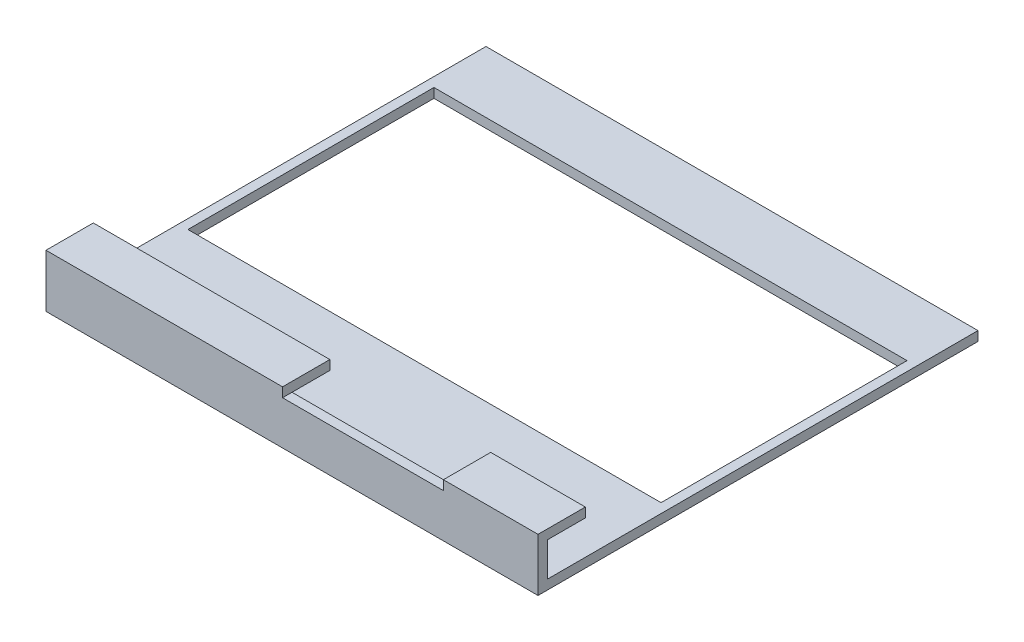
ISO-10303-21;
HEADER;
FILE_DESCRIPTION(('STEP AP214'),'2;1');
FILE_NAME('part.step','',(''),(''),'','','');
FILE_SCHEMA(('AUTOMOTIVE_DESIGN { 1 0 10303 214 1 1 1 1 }'));
ENDSEC;
DATA;
#1=APPLICATION_CONTEXT('core data for automotive mechanical design processes');
#2=APPLICATION_PROTOCOL_DEFINITION('international standard','automotive_design',2000,#1);
#3=PRODUCT_CONTEXT('',#1,'mechanical');
#4=PRODUCT('Part','Part','',(#3));
#5=PRODUCT_RELATED_PRODUCT_CATEGORY('part','',(#4));
#6=PRODUCT_DEFINITION_FORMATION('','',#4);
#7=PRODUCT_DEFINITION_CONTEXT('part definition',#1,'design');
#8=PRODUCT_DEFINITION('design','',#6,#7);
#9=PRODUCT_DEFINITION_SHAPE('','',#8);
#10=(LENGTH_UNIT() NAMED_UNIT(*) SI_UNIT(.MILLI.,.METRE.));
#11=(NAMED_UNIT(*) PLANE_ANGLE_UNIT() SI_UNIT($,.RADIAN.));
#12=(NAMED_UNIT(*) SI_UNIT($,.STERADIAN.) SOLID_ANGLE_UNIT());
#13=UNCERTAINTY_MEASURE_WITH_UNIT(LENGTH_MEASURE(1.E-05),#10,'distance_accuracy_value','');
#14=(GEOMETRIC_REPRESENTATION_CONTEXT(3) GLOBAL_UNCERTAINTY_ASSIGNED_CONTEXT((#13)) GLOBAL_UNIT_ASSIGNED_CONTEXT((#10,
#11,#12)) REPRESENTATION_CONTEXT('',''));
#15=CARTESIAN_POINT('',(0.,0.,0.));
#16=DIRECTION('',(0.,0.,1.));
#17=DIRECTION('',(1.,0.,0.));
#18=AXIS2_PLACEMENT_3D('',#15,#16,#17);
#19=CARTESIAN_POINT('',(104.,9.20000000000001,-10.));
#20=DIRECTION('',(0.,1.,0.));
#21=DIRECTION('',(0.,0.,1.));
#22=AXIS2_PLACEMENT_3D('',#19,#20,#21);
#23=PLANE('',#22);
#24=DIRECTION('',(-1.,0.,0.));
#25=VECTOR('',#24,1.);
#26=CARTESIAN_POINT('',(104.,9.20000000000001,-10.));
#27=LINE('',#26,#25);
#28=CARTESIAN_POINT('',(50.,9.20000000000001,-10.));
#29=VERTEX_POINT('',#28);
#30=CARTESIAN_POINT('',(0.,9.20000000000001,-10.));
#31=VERTEX_POINT('',#30);
#32=EDGE_CURVE('E267',#29,#31,#27,.T.);
#33=ORIENTED_EDGE('',*,*,#32,.F.);
#34=DIRECTION('',(0.,0.,-1.));
#35=VECTOR('',#34,1.);
#36=CARTESIAN_POINT('',(50.,9.20000000000001,-9.99999999999998));
#37=LINE('',#36,#35);
#38=CARTESIAN_POINT('',(50.,9.20000000000001,-2.));
#39=VERTEX_POINT('',#38);
#40=EDGE_CURVE('E198',#39,#29,#37,.T.);
#41=ORIENTED_EDGE('',*,*,#40,.F.);
#42=DIRECTION('',(-1.,0.,0.));
#43=VECTOR('',#42,1.);
#44=CARTESIAN_POINT('',(104.,9.20000000000001,-2.));
#45=LINE('',#44,#43);
#46=CARTESIAN_POINT('',(0.,9.20000000000001,-2.));
#47=VERTEX_POINT('',#46);
#48=EDGE_CURVE('E271',#39,#47,#45,.T.);
#49=ORIENTED_EDGE('',*,*,#48,.T.);
#50=DIRECTION('',(0.,0.,-1.));
#51=VECTOR('',#50,1.);
#52=CARTESIAN_POINT('',(0.,9.20000000000001,-10.));
#53=LINE('',#52,#51);
#54=EDGE_CURVE('E252',#47,#31,#53,.T.);
#55=ORIENTED_EDGE('',*,*,#54,.T.);
#56=EDGE_LOOP('',(#33,#41,#49,#55));
#57=FACE_BOUND('',#56,.T.);
#58=ADVANCED_FACE('F39',(#57),#23,.F.);
#59=CARTESIAN_POINT('',(104.,11.2,-10.));
#60=DIRECTION('',(0.,0.,1.));
#61=DIRECTION('',(1.,0.,0.));
#62=AXIS2_PLACEMENT_3D('',#59,#60,#61);
#63=PLANE('',#62);
#64=DIRECTION('',(-1.,0.,0.));
#65=VECTOR('',#64,1.);
#66=CARTESIAN_POINT('',(104.,11.2,-10.));
#67=LINE('',#66,#65);
#68=CARTESIAN_POINT('',(50.,11.2,-10.));
#69=VERTEX_POINT('',#68);
#70=CARTESIAN_POINT('',(0.,11.2,-10.));
#71=VERTEX_POINT('',#70);
#72=EDGE_CURVE('E263',#69,#71,#67,.T.);
#73=ORIENTED_EDGE('',*,*,#72,.F.);
#74=DIRECTION('',(0.,1.,0.));
#75=VECTOR('',#74,1.);
#76=CARTESIAN_POINT('',(50.,-26.2400902933387,-10.));
#77=LINE('',#76,#75);
#78=EDGE_CURVE('E208',#29,#69,#77,.T.);
#79=ORIENTED_EDGE('',*,*,#78,.F.);
#80=ORIENTED_EDGE('',*,*,#32,.T.);
#81=DIRECTION('',(0.,1.,0.));
#82=VECTOR('',#81,1.);
#83=CARTESIAN_POINT('',(0.,11.2,-10.));
#84=LINE('',#83,#82);
#85=EDGE_CURVE('E255',#31,#71,#84,.T.);
#86=ORIENTED_EDGE('',*,*,#85,.T.);
#87=EDGE_LOOP('',(#73,#79,#80,#86));
#88=FACE_BOUND('',#87,.T.);
#89=ADVANCED_FACE('F319',(#88),#63,.F.);
#90=CARTESIAN_POINT('',(104.,11.2,0.));
#91=DIRECTION('',(0.,-1.,0.));
#92=DIRECTION('',(0.,0.,-1.));
#93=AXIS2_PLACEMENT_3D('',#90,#91,#92);
#94=PLANE('',#93);
#95=DIRECTION('',(-1.,0.,0.));
#96=VECTOR('',#95,1.);
#97=CARTESIAN_POINT('',(104.,11.2,0.));
#98=LINE('',#97,#96);
#99=CARTESIAN_POINT('',(50.,11.2,0.));
#100=VERTEX_POINT('',#99);
#101=CARTESIAN_POINT('',(0.,11.2,0.));
#102=VERTEX_POINT('',#101);
#103=EDGE_CURVE('E240',#100,#102,#98,.T.);
#104=ORIENTED_EDGE('',*,*,#103,.F.);
#105=DIRECTION('',(0.,0.,1.));
#106=VECTOR('',#105,1.);
#107=CARTESIAN_POINT('',(50.,11.2,-10.));
#108=LINE('',#107,#106);
#109=EDGE_CURVE('E172',#69,#100,#108,.T.);
#110=ORIENTED_EDGE('',*,*,#109,.F.);
#111=ORIENTED_EDGE('',*,*,#72,.T.);
#112=DIRECTION('',(0.,0.,1.));
#113=VECTOR('',#112,1.);
#114=CARTESIAN_POINT('',(0.,11.2,0.));
#115=LINE('',#114,#113);
#116=EDGE_CURVE('E226',#71,#102,#115,.T.);
#117=ORIENTED_EDGE('',*,*,#116,.T.);
#118=EDGE_LOOP('',(#104,#110,#111,#117));
#119=FACE_BOUND('',#118,.T.);
#120=ADVANCED_FACE('F314',(#119),#94,.F.);
#121=CARTESIAN_POINT('',(104.,0.,0.));
#122=DIRECTION('',(0.,0.,-1.));
#123=DIRECTION('',(-1.,0.,0.));
#124=AXIS2_PLACEMENT_3D('',#121,#122,#123);
#125=PLANE('',#124);
#126=DIRECTION('',(-1.,0.,0.));
#127=VECTOR('',#126,1.);
#128=CARTESIAN_POINT('',(50.,9.20000000000001,0.));
#129=LINE('',#128,#127);
#130=CARTESIAN_POINT('',(84.,9.20000000000001,0.));
#131=VERTEX_POINT('',#130);
#132=CARTESIAN_POINT('',(50.,9.20000000000001,0.));
#133=VERTEX_POINT('',#132);
#134=EDGE_CURVE('E203',#131,#133,#129,.T.);
#135=ORIENTED_EDGE('',*,*,#134,.T.);
#136=DIRECTION('',(0.,1.,0.));
#137=VECTOR('',#136,1.);
#138=CARTESIAN_POINT('',(50.,-26.2400902933387,0.));
#139=LINE('',#138,#137);
#140=EDGE_CURVE('E207',#133,#100,#139,.T.);
#141=ORIENTED_EDGE('',*,*,#140,.T.);
#142=ORIENTED_EDGE('',*,*,#103,.T.);
#143=DIRECTION('',(0.,-1.,0.));
#144=VECTOR('',#143,1.);
#145=CARTESIAN_POINT('',(0.,0.,0.));
#146=LINE('',#145,#144);
#147=CARTESIAN_POINT('',(0.,0.,0.));
#148=VERTEX_POINT('',#147);
#149=EDGE_CURVE('E221',#102,#148,#146,.T.);
#150=ORIENTED_EDGE('',*,*,#149,.T.);
#151=DIRECTION('',(-1.,0.,0.));
#152=VECTOR('',#151,1.);
#153=CARTESIAN_POINT('',(104.,0.,0.));
#154=LINE('',#153,#152);
#155=CARTESIAN_POINT('',(104.,0.,0.));
#156=VERTEX_POINT('',#155);
#157=EDGE_CURVE('E11',#156,#148,#154,.T.);
#158=ORIENTED_EDGE('',*,*,#157,.F.);
#159=DIRECTION('',(0.,-1.,0.));
#160=VECTOR('',#159,1.);
#161=CARTESIAN_POINT('',(104.,0.,0.));
#162=LINE('',#161,#160);
#163=CARTESIAN_POINT('',(104.,11.2,0.));
#164=VERTEX_POINT('',#163);
#165=EDGE_CURVE('E222',#164,#156,#162,.T.);
#166=ORIENTED_EDGE('',*,*,#165,.F.);
#167=CARTESIAN_POINT('',(84.,11.2,0.));
#168=VERTEX_POINT('',#167);
#169=EDGE_CURVE('E260',#164,#168,#98,.T.);
#170=ORIENTED_EDGE('',*,*,#169,.T.);
#171=DIRECTION('',(0.,1.,0.));
#172=VECTOR('',#171,1.);
#173=CARTESIAN_POINT('',(84.,-26.2400902933387,0.));
#174=LINE('',#173,#172);
#175=EDGE_CURVE('E213',#131,#168,#174,.T.);
#176=ORIENTED_EDGE('',*,*,#175,.F.);
#177=EDGE_LOOP('',(#135,#141,#142,#150,#158,#166,#170,#176));
#178=FACE_BOUND('',#177,.T.);
#179=ADVANCED_FACE('F41',(#178),#125,.F.);
#180=CARTESIAN_POINT('',(104.,0.,0.));
#181=DIRECTION('',(0.,1.,0.));
#182=DIRECTION('',(0.,0.,1.));
#183=AXIS2_PLACEMENT_3D('',#180,#181,#182);
#184=PLANE('',#183);
#185=DIRECTION('',(1.,0.,0.));
#186=VECTOR('',#185,1.);
#187=CARTESIAN_POINT('',(2.,0.,-80.));
#188=LINE('',#187,#186);
#189=CARTESIAN_POINT('',(2.,0.,-80.));
#190=VERTEX_POINT('',#189);
#191=CARTESIAN_POINT('',(102.,0.,-80.));
#192=VERTEX_POINT('',#191);
#193=EDGE_CURVE('E178',#190,#192,#188,.T.);
#194=ORIENTED_EDGE('',*,*,#193,.F.);
#195=DIRECTION('',(0.,0.,-1.));
#196=VECTOR('',#195,1.);
#197=CARTESIAN_POINT('',(2.,0.,-80.));
#198=LINE('',#197,#196);
#199=CARTESIAN_POINT('',(2.00000000000001,0.,-28.));
#200=VERTEX_POINT('',#199);
#201=EDGE_CURVE('E160',#200,#190,#198,.T.);
#202=ORIENTED_EDGE('',*,*,#201,.F.);
#203=DIRECTION('',(-1.,0.,0.));
#204=VECTOR('',#203,1.);
#205=CARTESIAN_POINT('',(2.00000000000001,0.,-28.));
#206=LINE('',#205,#204);
#207=CARTESIAN_POINT('',(102.,0.,-28.));
#208=VERTEX_POINT('',#207);
#209=EDGE_CURVE('E169',#208,#200,#206,.T.);
#210=ORIENTED_EDGE('',*,*,#209,.F.);
#211=DIRECTION('',(0.,0.,1.));
#212=VECTOR('',#211,1.);
#213=CARTESIAN_POINT('',(102.,0.,-80.));
#214=LINE('',#213,#212);
#215=EDGE_CURVE('E54',#192,#208,#214,.T.);
#216=ORIENTED_EDGE('',*,*,#215,.F.);
#217=EDGE_LOOP('',(#194,#202,#210,#216));
#218=FACE_BOUND('',#217,.T.);
#219=DIRECTION('',(0.,0.,-1.));
#220=VECTOR('',#219,1.);
#221=CARTESIAN_POINT('',(0.,0.,0.));
#222=LINE('',#221,#220);
#223=CARTESIAN_POINT('',(0.,0.,-93.));
#224=VERTEX_POINT('',#223);
#225=EDGE_CURVE('E243',#148,#224,#222,.T.);
#226=ORIENTED_EDGE('',*,*,#225,.T.);
#227=DIRECTION('',(-1.,0.,0.));
#228=VECTOR('',#227,1.);
#229=CARTESIAN_POINT('',(104.,0.,-93.));
#230=LINE('',#229,#228);
#231=CARTESIAN_POINT('',(104.,0.,-93.));
#232=VERTEX_POINT('',#231);
#233=EDGE_CURVE('E47',#232,#224,#230,.T.);
#234=ORIENTED_EDGE('',*,*,#233,.F.);
#235=DIRECTION('',(0.,0.,-1.));
#236=VECTOR('',#235,1.);
#237=CARTESIAN_POINT('',(104.,0.,0.));
#238=LINE('',#237,#236);
#239=EDGE_CURVE('E225',#156,#232,#238,.T.);
#240=ORIENTED_EDGE('',*,*,#239,.F.);
#241=ORIENTED_EDGE('',*,*,#157,.T.);
#242=EDGE_LOOP('',(#226,#234,#240,#241));
#243=FACE_BOUND('',#242,.T.);
#244=ADVANCED_FACE('F175',(#218,#243),#184,.F.);
#245=CARTESIAN_POINT('',(104.,0.,-93.));
#246=DIRECTION('',(0.,0.,1.));
#247=DIRECTION('',(1.,0.,0.));
#248=AXIS2_PLACEMENT_3D('',#245,#246,#247);
#249=PLANE('',#248);
#250=DIRECTION('',(0.,1.,0.));
#251=VECTOR('',#250,1.);
#252=CARTESIAN_POINT('',(0.,0.,-93.));
#253=LINE('',#252,#251);
#254=CARTESIAN_POINT('',(0.,2.00000000000001,-93.));
#255=VERTEX_POINT('',#254);
#256=EDGE_CURVE('E245',#224,#255,#253,.T.);
#257=ORIENTED_EDGE('',*,*,#256,.T.);
#258=DIRECTION('',(-1.,0.,0.));
#259=VECTOR('',#258,1.);
#260=CARTESIAN_POINT('',(104.,2.00000000000001,-93.));
#261=LINE('',#260,#259);
#262=CARTESIAN_POINT('',(104.,2.00000000000001,-93.));
#263=VERTEX_POINT('',#262);
#264=EDGE_CURVE('E278',#263,#255,#261,.T.);
#265=ORIENTED_EDGE('',*,*,#264,.F.);
#266=DIRECTION('',(0.,1.,0.));
#267=VECTOR('',#266,1.);
#268=CARTESIAN_POINT('',(104.,0.,-93.));
#269=LINE('',#268,#267);
#270=EDGE_CURVE('E228',#232,#263,#269,.T.);
#271=ORIENTED_EDGE('',*,*,#270,.F.);
#272=ORIENTED_EDGE('',*,*,#233,.T.);
#273=EDGE_LOOP('',(#257,#265,#271,#272));
#274=FACE_BOUND('',#273,.T.);
#275=ADVANCED_FACE('F285',(#274),#249,.F.);
#276=CARTESIAN_POINT('',(104.,2.00000000000001,-93.));
#277=DIRECTION('',(0.,-1.,0.));
#278=DIRECTION('',(0.,0.,-1.));
#279=AXIS2_PLACEMENT_3D('',#276,#277,#278);
#280=PLANE('',#279);
#281=DIRECTION('',(1.,0.,0.));
#282=VECTOR('',#281,1.);
#283=CARTESIAN_POINT('',(2.00000000000001,2.00000000000001,-28.));
#284=LINE('',#283,#282);
#285=CARTESIAN_POINT('',(2.,2.00000000000001,-28.));
#286=VERTEX_POINT('',#285);
#287=CARTESIAN_POINT('',(102.,2.00000000000001,-28.));
#288=VERTEX_POINT('',#287);
#289=EDGE_CURVE('E180',#286,#288,#284,.T.);
#290=ORIENTED_EDGE('',*,*,#289,.F.);
#291=DIRECTION('',(0.,0.,1.));
#292=VECTOR('',#291,1.);
#293=CARTESIAN_POINT('',(2.,2.00000000000001,-80.));
#294=LINE('',#293,#292);
#295=CARTESIAN_POINT('',(2.,2.00000000000001,-80.));
#296=VERTEX_POINT('',#295);
#297=EDGE_CURVE('E62',#296,#286,#294,.T.);
#298=ORIENTED_EDGE('',*,*,#297,.F.);
#299=DIRECTION('',(-1.,0.,0.));
#300=VECTOR('',#299,1.);
#301=CARTESIAN_POINT('',(2.,2.00000000000001,-80.));
#302=LINE('',#301,#300);
#303=CARTESIAN_POINT('',(102.,2.00000000000001,-80.));
#304=VERTEX_POINT('',#303);
#305=EDGE_CURVE('E166',#304,#296,#302,.T.);
#306=ORIENTED_EDGE('',*,*,#305,.F.);
#307=DIRECTION('',(0.,0.,-1.));
#308=VECTOR('',#307,1.);
#309=CARTESIAN_POINT('',(102.,2.00000000000001,-80.));
#310=LINE('',#309,#308);
#311=EDGE_CURVE('E186',#288,#304,#310,.T.);
#312=ORIENTED_EDGE('',*,*,#311,.F.);
#313=EDGE_LOOP('',(#290,#298,#306,#312));
#314=FACE_BOUND('',#313,.T.);
#315=DIRECTION('',(0.,0.,1.));
#316=VECTOR('',#315,1.);
#317=CARTESIAN_POINT('',(0.,2.00000000000001,-93.));
#318=LINE('',#317,#316);
#319=CARTESIAN_POINT('',(0.,2.00000000000001,-2.));
#320=VERTEX_POINT('',#319);
#321=EDGE_CURVE('E247',#255,#320,#318,.T.);
#322=ORIENTED_EDGE('',*,*,#321,.T.);
#323=DIRECTION('',(-1.,0.,0.));
#324=VECTOR('',#323,1.);
#325=CARTESIAN_POINT('',(104.,2.00000000000001,-2.));
#326=LINE('',#325,#324);
#327=CARTESIAN_POINT('',(104.,2.00000000000001,-2.));
#328=VERTEX_POINT('',#327);
#329=EDGE_CURVE('E275',#328,#320,#326,.T.);
#330=ORIENTED_EDGE('',*,*,#329,.F.);
#331=DIRECTION('',(0.,0.,1.));
#332=VECTOR('',#331,1.);
#333=CARTESIAN_POINT('',(104.,2.00000000000001,-93.));
#334=LINE('',#333,#332);
#335=EDGE_CURVE('E230',#263,#328,#334,.T.);
#336=ORIENTED_EDGE('',*,*,#335,.F.);
#337=ORIENTED_EDGE('',*,*,#264,.T.);
#338=EDGE_LOOP('',(#322,#330,#336,#337));
#339=FACE_BOUND('',#338,.T.);
#340=ADVANCED_FACE('F295',(#314,#339),#280,.F.);
#341=CARTESIAN_POINT('',(104.,2.00000000000001,-2.));
#342=DIRECTION('',(0.,0.,1.));
#343=DIRECTION('',(1.,0.,0.));
#344=AXIS2_PLACEMENT_3D('',#341,#342,#343);
#345=PLANE('',#344);
#346=DIRECTION('',(0.,1.,0.));
#347=VECTOR('',#346,1.);
#348=CARTESIAN_POINT('',(0.,2.00000000000001,-2.));
#349=LINE('',#348,#347);
#350=EDGE_CURVE('E249',#320,#47,#349,.T.);
#351=ORIENTED_EDGE('',*,*,#350,.T.);
#352=ORIENTED_EDGE('',*,*,#48,.F.);
#353=DIRECTION('',(-1.,0.,0.));
#354=VECTOR('',#353,1.);
#355=CARTESIAN_POINT('',(104.,9.20000000000001,-2.));
#356=LINE('',#355,#354);
#357=CARTESIAN_POINT('',(84.,9.20000000000001,-2.));
#358=VERTEX_POINT('',#357);
#359=EDGE_CURVE('E219',#358,#39,#356,.T.);
#360=ORIENTED_EDGE('',*,*,#359,.F.);
#361=CARTESIAN_POINT('',(104.,9.20000000000001,-2.));
#362=VERTEX_POINT('',#361);
#363=EDGE_CURVE('E272',#362,#358,#45,.T.);
#364=ORIENTED_EDGE('',*,*,#363,.F.);
#365=DIRECTION('',(0.,1.,0.));
#366=VECTOR('',#365,1.);
#367=CARTESIAN_POINT('',(104.,2.00000000000001,-2.));
#368=LINE('',#367,#366);
#369=EDGE_CURVE('E232',#328,#362,#368,.T.);
#370=ORIENTED_EDGE('',*,*,#369,.F.);
#371=ORIENTED_EDGE('',*,*,#329,.T.);
#372=EDGE_LOOP('',(#351,#352,#360,#364,#370,#371));
#373=FACE_BOUND('',#372,.T.);
#374=ADVANCED_FACE('F299',(#373),#345,.F.);
#375=ORIENTED_EDGE('',*,*,#363,.T.);
#376=DIRECTION('',(0.,0.,1.));
#377=VECTOR('',#376,1.);
#378=CARTESIAN_POINT('',(84.,9.20000000000001,-9.99999999999998));
#379=LINE('',#378,#377);
#380=CARTESIAN_POINT('',(84.,9.20000000000001,-10.));
#381=VERTEX_POINT('',#380);
#382=EDGE_CURVE('E195',#381,#358,#379,.T.);
#383=ORIENTED_EDGE('',*,*,#382,.F.);
#384=CARTESIAN_POINT('',(104.,9.20000000000001,-10.));
#385=VERTEX_POINT('',#384);
#386=EDGE_CURVE('E268',#385,#381,#27,.T.);
#387=ORIENTED_EDGE('',*,*,#386,.F.);
#388=DIRECTION('',(0.,0.,-1.));
#389=VECTOR('',#388,1.);
#390=CARTESIAN_POINT('',(104.,9.20000000000001,-10.));
#391=LINE('',#390,#389);
#392=EDGE_CURVE('E234',#362,#385,#391,.T.);
#393=ORIENTED_EDGE('',*,*,#392,.F.);
#394=EDGE_LOOP('',(#375,#383,#387,#393));
#395=FACE_BOUND('',#394,.T.);
#396=ADVANCED_FACE('F326',(#395),#23,.F.);
#397=ORIENTED_EDGE('',*,*,#386,.T.);
#398=DIRECTION('',(0.,1.,0.));
#399=VECTOR('',#398,1.);
#400=CARTESIAN_POINT('',(84.,-26.2400902933387,-10.));
#401=LINE('',#400,#399);
#402=CARTESIAN_POINT('',(84.,11.2,-10.));
#403=VERTEX_POINT('',#402);
#404=EDGE_CURVE('E210',#381,#403,#401,.T.);
#405=ORIENTED_EDGE('',*,*,#404,.T.);
#406=CARTESIAN_POINT('',(104.,11.2,-10.));
#407=VERTEX_POINT('',#406);
#408=EDGE_CURVE('E264',#407,#403,#67,.T.);
#409=ORIENTED_EDGE('',*,*,#408,.F.);
#410=DIRECTION('',(0.,1.,0.));
#411=VECTOR('',#410,1.);
#412=CARTESIAN_POINT('',(104.,11.2,-10.));
#413=LINE('',#412,#411);
#414=EDGE_CURVE('E236',#385,#407,#413,.T.);
#415=ORIENTED_EDGE('',*,*,#414,.F.);
#416=EDGE_LOOP('',(#397,#405,#409,#415));
#417=FACE_BOUND('',#416,.T.);
#418=ADVANCED_FACE('F330',(#417),#63,.F.);
#419=ORIENTED_EDGE('',*,*,#408,.T.);
#420=DIRECTION('',(0.,0.,-1.));
#421=VECTOR('',#420,1.);
#422=CARTESIAN_POINT('',(84.,11.2,-10.));
#423=LINE('',#422,#421);
#424=EDGE_CURVE('E205',#168,#403,#423,.T.);
#425=ORIENTED_EDGE('',*,*,#424,.F.);
#426=ORIENTED_EDGE('',*,*,#169,.F.);
#427=DIRECTION('',(0.,0.,1.));
#428=VECTOR('',#427,1.);
#429=CARTESIAN_POINT('',(104.,11.2,0.));
#430=LINE('',#429,#428);
#431=EDGE_CURVE('E238',#407,#164,#430,.T.);
#432=ORIENTED_EDGE('',*,*,#431,.F.);
#433=EDGE_LOOP('',(#419,#425,#426,#432));
#434=FACE_BOUND('',#433,.T.);
#435=ADVANCED_FACE('F335',(#434),#94,.F.);
#436=CARTESIAN_POINT('',(104.,0.,0.));
#437=DIRECTION('',(-1.,0.,0.));
#438=DIRECTION('',(0.,0.,1.));
#439=AXIS2_PLACEMENT_3D('',#436,#437,#438);
#440=PLANE('',#439);
#441=ORIENTED_EDGE('',*,*,#165,.T.);
#442=ORIENTED_EDGE('',*,*,#239,.T.);
#443=ORIENTED_EDGE('',*,*,#270,.T.);
#444=ORIENTED_EDGE('',*,*,#335,.T.);
#445=ORIENTED_EDGE('',*,*,#369,.T.);
#446=ORIENTED_EDGE('',*,*,#392,.T.);
#447=ORIENTED_EDGE('',*,*,#414,.T.);
#448=ORIENTED_EDGE('',*,*,#431,.T.);
#449=EDGE_LOOP('',(#441,#442,#443,#444,#445,#446,#447,#448));
#450=FACE_BOUND('',#449,.T.);
#451=ADVANCED_FACE('F305',(#450),#440,.F.);
#452=CARTESIAN_POINT('',(0.,0.,0.));
#453=DIRECTION('',(-1.,0.,0.));
#454=DIRECTION('',(0.,0.,1.));
#455=AXIS2_PLACEMENT_3D('',#452,#453,#454);
#456=PLANE('',#455);
#457=ORIENTED_EDGE('',*,*,#149,.F.);
#458=ORIENTED_EDGE('',*,*,#116,.F.);
#459=ORIENTED_EDGE('',*,*,#85,.F.);
#460=ORIENTED_EDGE('',*,*,#54,.F.);
#461=ORIENTED_EDGE('',*,*,#350,.F.);
#462=ORIENTED_EDGE('',*,*,#321,.F.);
#463=ORIENTED_EDGE('',*,*,#256,.F.);
#464=ORIENTED_EDGE('',*,*,#225,.F.);
#465=EDGE_LOOP('',(#457,#458,#459,#460,#461,#462,#463,#464));
#466=FACE_BOUND('',#465,.T.);
#467=ADVANCED_FACE('F290',(#466),#456,.T.);
#468=CARTESIAN_POINT('',(104.,9.20000000000001,-10.));
#469=DIRECTION('',(0.,1.,0.));
#470=DIRECTION('',(0.,0.,1.));
#471=AXIS2_PLACEMENT_3D('',#468,#469,#470);
#472=PLANE('',#471);
#473=ORIENTED_EDGE('',*,*,#359,.T.);
#474=EDGE_CURVE('E200',#133,#39,#37,.T.);
#475=ORIENTED_EDGE('',*,*,#474,.F.);
#476=ORIENTED_EDGE('',*,*,#134,.F.);
#477=EDGE_CURVE('E199',#358,#131,#379,.T.);
#478=ORIENTED_EDGE('',*,*,#477,.F.);
#479=EDGE_LOOP('',(#473,#475,#476,#478));
#480=FACE_BOUND('',#479,.T.);
#481=ADVANCED_FACE('F340',(#480),#472,.T.);
#482=CARTESIAN_POINT('',(50.,-26.2400902933387,-10.));
#483=DIRECTION('',(-1.,0.,0.));
#484=DIRECTION('',(0.,0.,1.));
#485=AXIS2_PLACEMENT_3D('',#482,#483,#484);
#486=PLANE('',#485);
#487=ORIENTED_EDGE('',*,*,#474,.T.);
#488=ORIENTED_EDGE('',*,*,#40,.T.);
#489=ORIENTED_EDGE('',*,*,#78,.T.);
#490=ORIENTED_EDGE('',*,*,#109,.T.);
#491=ORIENTED_EDGE('',*,*,#140,.F.);
#492=EDGE_LOOP('',(#487,#488,#489,#490,#491));
#493=FACE_BOUND('',#492,.T.);
#494=ADVANCED_FACE('F343',(#493),#486,.F.);
#495=CARTESIAN_POINT('',(84.,-26.2400902933387,-10.));
#496=DIRECTION('',(1.,0.,0.));
#497=DIRECTION('',(0.,0.,-1.));
#498=AXIS2_PLACEMENT_3D('',#495,#496,#497);
#499=PLANE('',#498);
#500=ORIENTED_EDGE('',*,*,#382,.T.);
#501=ORIENTED_EDGE('',*,*,#477,.T.);
#502=ORIENTED_EDGE('',*,*,#175,.T.);
#503=ORIENTED_EDGE('',*,*,#424,.T.);
#504=ORIENTED_EDGE('',*,*,#404,.F.);
#505=EDGE_LOOP('',(#500,#501,#502,#503,#504));
#506=FACE_BOUND('',#505,.T.);
#507=ADVANCED_FACE('F339',(#506),#499,.F.);
#508=CARTESIAN_POINT('',(2.,-0.00100000000000013,-80.));
#509=DIRECTION('',(-1.,0.,0.));
#510=DIRECTION('',(0.,0.,1.));
#511=AXIS2_PLACEMENT_3D('',#508,#509,#510);
#512=PLANE('',#511);
#513=ORIENTED_EDGE('',*,*,#201,.T.);
#514=DIRECTION('',(0.,1.,0.));
#515=VECTOR('',#514,1.);
#516=CARTESIAN_POINT('',(2.,-0.00100000000000013,-80.));
#517=LINE('',#516,#515);
#518=EDGE_CURVE('E173',#190,#296,#517,.T.);
#519=ORIENTED_EDGE('',*,*,#518,.T.);
#520=ORIENTED_EDGE('',*,*,#297,.T.);
#521=DIRECTION('',(0.,1.,0.));
#522=VECTOR('',#521,1.);
#523=CARTESIAN_POINT('',(2.00000000000001,-0.00100000000000013,-28.));
#524=LINE('',#523,#522);
#525=EDGE_CURVE('E156',#200,#286,#524,.T.);
#526=ORIENTED_EDGE('',*,*,#525,.F.);
#527=EDGE_LOOP('',(#513,#519,#520,#526));
#528=FACE_BOUND('',#527,.T.);
#529=ADVANCED_FACE('F158',(#528),#512,.F.);
#530=CARTESIAN_POINT('',(2.,-0.00100000000000013,-80.));
#531=DIRECTION('',(0.,0.,-1.));
#532=DIRECTION('',(-1.,0.,0.));
#533=AXIS2_PLACEMENT_3D('',#530,#531,#532);
#534=PLANE('',#533);
#535=ORIENTED_EDGE('',*,*,#193,.T.);
#536=DIRECTION('',(0.,1.,0.));
#537=VECTOR('',#536,1.);
#538=CARTESIAN_POINT('',(102.,-0.00100000000000013,-80.));
#539=LINE('',#538,#537);
#540=EDGE_CURVE('E192',#192,#304,#539,.T.);
#541=ORIENTED_EDGE('',*,*,#540,.T.);
#542=ORIENTED_EDGE('',*,*,#305,.T.);
#543=ORIENTED_EDGE('',*,*,#518,.F.);
#544=EDGE_LOOP('',(#535,#541,#542,#543));
#545=FACE_BOUND('',#544,.T.);
#546=ADVANCED_FACE('F434',(#545),#534,.F.);
#547=CARTESIAN_POINT('',(102.,-0.00100000000000013,-80.));
#548=DIRECTION('',(1.,0.,0.));
#549=DIRECTION('',(0.,0.,-1.));
#550=AXIS2_PLACEMENT_3D('',#547,#548,#549);
#551=PLANE('',#550);
#552=ORIENTED_EDGE('',*,*,#215,.T.);
#553=DIRECTION('',(0.,1.,0.));
#554=VECTOR('',#553,1.);
#555=CARTESIAN_POINT('',(102.,-0.00100000000000013,-28.));
#556=LINE('',#555,#554);
#557=EDGE_CURVE('E165',#208,#288,#556,.T.);
#558=ORIENTED_EDGE('',*,*,#557,.T.);
#559=ORIENTED_EDGE('',*,*,#311,.T.);
#560=ORIENTED_EDGE('',*,*,#540,.F.);
#561=EDGE_LOOP('',(#552,#558,#559,#560));
#562=FACE_BOUND('',#561,.T.);
#563=ADVANCED_FACE('F443',(#562),#551,.F.);
#564=CARTESIAN_POINT('',(2.00000000000001,-0.00100000000000013,-28.));
#565=DIRECTION('',(0.,0.,1.));
#566=DIRECTION('',(1.,0.,0.));
#567=AXIS2_PLACEMENT_3D('',#564,#565,#566);
#568=PLANE('',#567);
#569=ORIENTED_EDGE('',*,*,#209,.T.);
#570=ORIENTED_EDGE('',*,*,#525,.T.);
#571=ORIENTED_EDGE('',*,*,#289,.T.);
#572=ORIENTED_EDGE('',*,*,#557,.F.);
#573=EDGE_LOOP('',(#569,#570,#571,#572));
#574=FACE_BOUND('',#573,.T.);
#575=ADVANCED_FACE('F170',(#574),#568,.F.);
#576=CLOSED_SHELL('',(#58,#89,#120,#179,#244,#275,#340,#374,#396,#418,#435,#451,#467,#481,#494,
#507,#529,#546,#563,#575));
#577=MANIFOLD_SOLID_BREP('B2',#576);
#578=ADVANCED_BREP_SHAPE_REPRESENTATION('',(#18,#577),#14);
#579=SHAPE_DEFINITION_REPRESENTATION(#9,#578);
ENDSEC;
END-ISO-10303-21;
